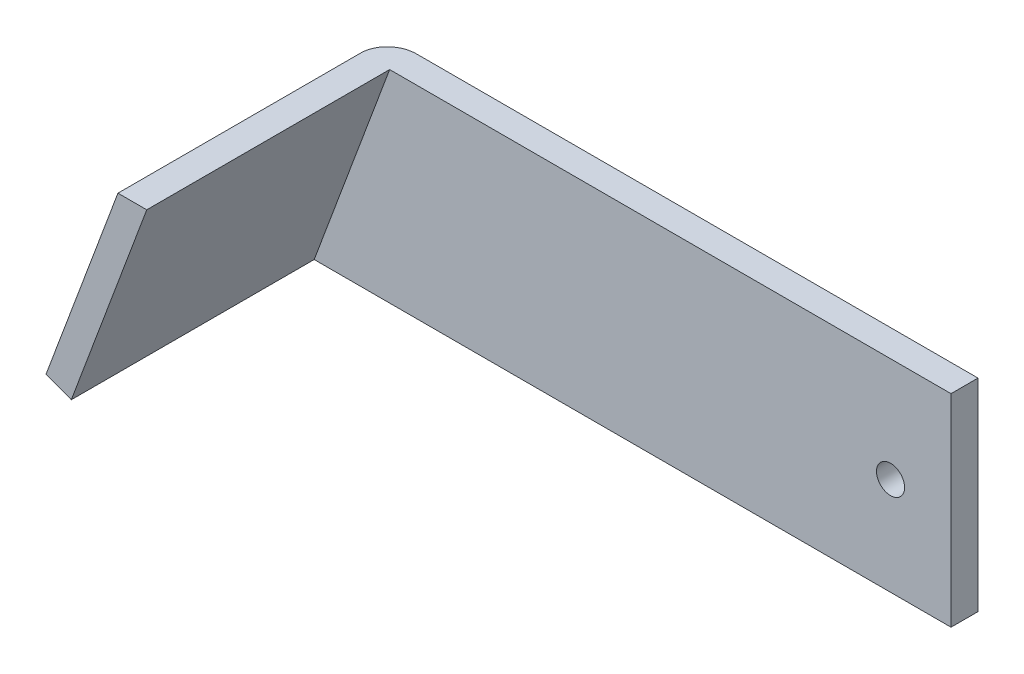
ISO-10303-21;
HEADER;
FILE_DESCRIPTION(('STEP AP214'),'2;1');
FILE_NAME('part.step','',(''),(''),'','','');
FILE_SCHEMA(('AUTOMOTIVE_DESIGN { 1 0 10303 214 1 1 1 1 }'));
ENDSEC;
DATA;
#1=APPLICATION_CONTEXT('core data for automotive mechanical design processes');
#2=APPLICATION_PROTOCOL_DEFINITION('international standard','automotive_design',2000,#1);
#3=PRODUCT_CONTEXT('',#1,'mechanical');
#4=PRODUCT('Part','Part','',(#3));
#5=PRODUCT_RELATED_PRODUCT_CATEGORY('part','',(#4));
#6=PRODUCT_DEFINITION_FORMATION('','',#4);
#7=PRODUCT_DEFINITION_CONTEXT('part definition',#1,'design');
#8=PRODUCT_DEFINITION('design','',#6,#7);
#9=PRODUCT_DEFINITION_SHAPE('','',#8);
#10=(LENGTH_UNIT() NAMED_UNIT(*) SI_UNIT(.MILLI.,.METRE.));
#11=(NAMED_UNIT(*) PLANE_ANGLE_UNIT() SI_UNIT($,.RADIAN.));
#12=(NAMED_UNIT(*) SI_UNIT($,.STERADIAN.) SOLID_ANGLE_UNIT());
#13=UNCERTAINTY_MEASURE_WITH_UNIT(LENGTH_MEASURE(1.E-05),#10,'distance_accuracy_value','');
#14=(GEOMETRIC_REPRESENTATION_CONTEXT(3) GLOBAL_UNCERTAINTY_ASSIGNED_CONTEXT((#13)) GLOBAL_UNIT_ASSIGNED_CONTEXT((#10,
#11,#12)) REPRESENTATION_CONTEXT('',''));
#15=CARTESIAN_POINT('',(0.,0.,0.));
#16=DIRECTION('',(0.,0.,1.));
#17=DIRECTION('',(1.,0.,0.));
#18=AXIS2_PLACEMENT_3D('',#15,#16,#17);
#19=CARTESIAN_POINT('',(-66.04,0.,-3.175));
#20=DIRECTION('',(0.,1.,0.));
#21=DIRECTION('',(0.,0.,1.));
#22=AXIS2_PLACEMENT_3D('',#19,#20,#21);
#23=PLANE('',#22);
#24=DIRECTION('',(-1.,0.,0.));
#25=VECTOR('',#24,1.);
#26=CARTESIAN_POINT('',(-66.04,0.,0.));
#27=LINE('',#26,#25);
#28=CARTESIAN_POINT('',(0.,0.,0.));
#29=VERTEX_POINT('',#28);
#30=CARTESIAN_POINT('',(-66.04,0.,0.));
#31=VERTEX_POINT('',#30);
#32=EDGE_CURVE('E118',#29,#31,#27,.T.);
#33=ORIENTED_EDGE('',*,*,#32,.F.);
#34=DIRECTION('',(0.,0.,1.));
#35=VECTOR('',#34,1.);
#36=CARTESIAN_POINT('',(0.,0.,-3.175));
#37=LINE('',#36,#35);
#38=CARTESIAN_POINT('',(0.,0.,-3.175));
#39=VERTEX_POINT('',#38);
#40=EDGE_CURVE('E11',#39,#29,#37,.T.);
#41=ORIENTED_EDGE('',*,*,#40,.F.);
#42=DIRECTION('',(-1.,0.,0.));
#43=VECTOR('',#42,1.);
#44=CARTESIAN_POINT('',(-66.04,0.,-3.175));
#45=LINE('',#44,#43);
#46=CARTESIAN_POINT('',(-66.04,0.,-3.17499999999999));
#47=VERTEX_POINT('',#46);
#48=EDGE_CURVE('E116',#39,#47,#45,.T.);
#49=ORIENTED_EDGE('',*,*,#48,.T.);
#50=CARTESIAN_POINT('',(-66.04,0.,0.));
#51=DIRECTION('',(0.,-1.,0.));
#52=DIRECTION('',(1.,0.,0.));
#53=AXIS2_PLACEMENT_3D('',#50,#51,#52);
#54=ELLIPSE('',#53,3.38877601493509,3.175);
#55=CARTESIAN_POINT('',(-69.4287760149352,0.,0.));
#56=VERTEX_POINT('',#55);
#57=EDGE_CURVE('E101',#47,#56,#54,.F.);
#58=ORIENTED_EDGE('',*,*,#57,.T.);
#59=DIRECTION('',(0.,0.,1.));
#60=VECTOR('',#59,1.);
#61=CARTESIAN_POINT('',(-69.4287760149352,0.,-5.588));
#62=LINE('',#61,#60);
#63=CARTESIAN_POINT('',(-69.4287760149352,0.,28.575));
#64=VERTEX_POINT('',#63);
#65=EDGE_CURVE('E303',#56,#64,#62,.T.);
#66=ORIENTED_EDGE('',*,*,#65,.T.);
#67=DIRECTION('',(-1.,0.,0.));
#68=VECTOR('',#67,1.);
#69=CARTESIAN_POINT('',(-69.0147097345982,0.,28.575));
#70=LINE('',#69,#68);
#71=CARTESIAN_POINT('',(-66.0400000000001,0.,28.575));
#72=VERTEX_POINT('',#71);
#73=EDGE_CURVE('E109',#72,#64,#70,.T.);
#74=ORIENTED_EDGE('',*,*,#73,.F.);
#75=DIRECTION('',(0.,0.,-1.));
#76=VECTOR('',#75,1.);
#77=CARTESIAN_POINT('',(-66.04,0.,0.));
#78=LINE('',#77,#76);
#79=EDGE_CURVE('E143',#72,#31,#78,.T.);
#80=ORIENTED_EDGE('',*,*,#79,.T.);
#81=EDGE_LOOP('',(#33,#41,#49,#58,#66,#74,#80));
#82=FACE_BOUND('',#81,.T.);
#83=ADVANCED_FACE('F36',(#82),#23,.T.);
#84=CARTESIAN_POINT('',(0.,-23.7976778767849,-3.175));
#85=DIRECTION('',(1.,0.,0.));
#86=DIRECTION('',(0.,0.,-1.));
#87=AXIS2_PLACEMENT_3D('',#84,#85,#86);
#88=PLANE('',#87);
#89=DIRECTION('',(0.,1.,0.));
#90=VECTOR('',#89,1.);
#91=CARTESIAN_POINT('',(0.,-23.7976778767849,0.));
#92=LINE('',#91,#90);
#93=CARTESIAN_POINT('',(0.,-23.7976778767849,0.));
#94=VERTEX_POINT('',#93);
#95=EDGE_CURVE('E131',#94,#29,#92,.T.);
#96=ORIENTED_EDGE('',*,*,#95,.F.);
#97=DIRECTION('',(0.,0.,1.));
#98=VECTOR('',#97,1.);
#99=CARTESIAN_POINT('',(0.,-23.7976778767849,-3.175));
#100=LINE('',#99,#98);
#101=CARTESIAN_POINT('',(0.,-23.7976778767849,-3.175));
#102=VERTEX_POINT('',#101);
#103=EDGE_CURVE('E46',#102,#94,#100,.T.);
#104=ORIENTED_EDGE('',*,*,#103,.F.);
#105=DIRECTION('',(0.,1.,0.));
#106=VECTOR('',#105,1.);
#107=CARTESIAN_POINT('',(0.,-23.7976778767849,-3.175));
#108=LINE('',#107,#106);
#109=EDGE_CURVE('E120',#102,#39,#108,.T.);
#110=ORIENTED_EDGE('',*,*,#109,.T.);
#111=ORIENTED_EDGE('',*,*,#40,.T.);
#112=EDGE_LOOP('',(#96,#104,#110,#111));
#113=FACE_BOUND('',#112,.T.);
#114=ADVANCED_FACE('F178',(#113),#88,.T.);
#115=CARTESIAN_POINT('',(-74.9186557356835,-23.7976778767849,-3.175));
#116=DIRECTION('',(0.,-1.,0.));
#117=DIRECTION('',(1.,0.,0.));
#118=AXIS2_PLACEMENT_3D('',#115,#116,#117);
#119=PLANE('',#118);
#120=DIRECTION('',(1.,0.,0.));
#121=VECTOR('',#120,1.);
#122=CARTESIAN_POINT('',(-74.9186557356835,-23.7976778767849,0.));
#123=LINE('',#122,#121);
#124=CARTESIAN_POINT('',(-74.9186557356835,-23.7976778767848,0.));
#125=VERTEX_POINT('',#124);
#126=EDGE_CURVE('E127',#125,#94,#123,.T.);
#127=ORIENTED_EDGE('',*,*,#126,.F.);
#128=DIRECTION('',(0.,0.,1.));
#129=VECTOR('',#128,1.);
#130=CARTESIAN_POINT('',(-74.9186557356835,-23.7976778767849,-3.175));
#131=LINE('',#130,#129);
#132=CARTESIAN_POINT('',(-74.9186557356835,-23.7976778767849,-3.175));
#133=VERTEX_POINT('',#132);
#134=EDGE_CURVE('E40',#133,#125,#131,.T.);
#135=ORIENTED_EDGE('',*,*,#134,.F.);
#136=DIRECTION('',(1.,0.,0.));
#137=VECTOR('',#136,1.);
#138=CARTESIAN_POINT('',(-74.9186557356835,-23.7976778767849,-3.175));
#139=LINE('',#138,#137);
#140=EDGE_CURVE('E117',#133,#102,#139,.T.);
#141=ORIENTED_EDGE('',*,*,#140,.T.);
#142=ORIENTED_EDGE('',*,*,#103,.T.);
#143=EDGE_LOOP('',(#127,#135,#141,#142));
#144=FACE_BOUND('',#143,.T.);
#145=ADVANCED_FACE('F38',(#144),#119,.T.);
#146=CARTESIAN_POINT('',(0.,0.,-3.175));
#147=DIRECTION('',(0.,0.,1.));
#148=DIRECTION('',(1.,0.,0.));
#149=AXIS2_PLACEMENT_3D('',#146,#147,#148);
#150=PLANE('',#149);
#151=CARTESIAN_POINT('',(-7.112,-12.2967276653846,-3.175));
#152=DIRECTION('',(0.,0.,1.));
#153=DIRECTION('',(1.,0.,0.));
#154=AXIS2_PLACEMENT_3D('',#151,#152,#153);
#155=CIRCLE('',#154,1.651);
#156=CARTESIAN_POINT('',(-5.461,-12.2967276653846,-3.175));
#157=VERTEX_POINT('',#156);
#158=EDGE_CURVE('E128',#157,#157,#155,.T.);
#159=ORIENTED_EDGE('',*,*,#158,.T.);
#160=EDGE_LOOP('',(#159));
#161=FACE_BOUND('',#160,.T.);
#162=DIRECTION('',(-0.349553375420609,-0.936916451841923,0.));
#163=VECTOR('',#162,1.);
#164=CARTESIAN_POINT('',(-66.04,0.,-3.175));
#165=LINE('',#164,#163);
#166=EDGE_CURVE('E104',#47,#133,#165,.T.);
#167=ORIENTED_EDGE('',*,*,#166,.F.);
#168=ORIENTED_EDGE('',*,*,#48,.F.);
#169=ORIENTED_EDGE('',*,*,#109,.F.);
#170=ORIENTED_EDGE('',*,*,#140,.F.);
#171=EDGE_LOOP('',(#167,#168,#169,#170));
#172=FACE_BOUND('',#171,.T.);
#173=ADVANCED_FACE('F114',(#161,#172),#150,.F.);
#174=CARTESIAN_POINT('',(0.,0.,0.));
#175=DIRECTION('',(0.,0.,1.));
#176=DIRECTION('',(1.,0.,0.));
#177=AXIS2_PLACEMENT_3D('',#174,#175,#176);
#178=PLANE('',#177);
#179=CARTESIAN_POINT('',(-7.112,-12.2967276653846,0.));
#180=DIRECTION('',(0.,0.,1.));
#181=DIRECTION('',(1.,0.,0.));
#182=AXIS2_PLACEMENT_3D('',#179,#180,#181);
#183=CIRCLE('',#182,1.651);
#184=CARTESIAN_POINT('',(-5.461,-12.2967276653846,0.));
#185=VERTEX_POINT('',#184);
#186=EDGE_CURVE('E157',#185,#185,#183,.T.);
#187=ORIENTED_EDGE('',*,*,#186,.F.);
#188=EDGE_LOOP('',(#187));
#189=FACE_BOUND('',#188,.T.);
#190=DIRECTION('',(-0.349553375420609,-0.936916451841923,0.));
#191=VECTOR('',#190,1.);
#192=CARTESIAN_POINT('',(-66.04,0.,0.));
#193=LINE('',#192,#191);
#194=EDGE_CURVE('E125',#31,#125,#193,.T.);
#195=ORIENTED_EDGE('',*,*,#194,.T.);
#196=ORIENTED_EDGE('',*,*,#126,.T.);
#197=ORIENTED_EDGE('',*,*,#95,.T.);
#198=ORIENTED_EDGE('',*,*,#32,.T.);
#199=EDGE_LOOP('',(#195,#196,#197,#198));
#200=FACE_BOUND('',#199,.T.);
#201=ADVANCED_FACE('F137',(#189,#200),#178,.T.);
#202=CARTESIAN_POINT('',(-7.112,-12.2967276653846,-3.175));
#203=DIRECTION('',(0.,0.,1.));
#204=DIRECTION('',(1.,0.,0.));
#205=AXIS2_PLACEMENT_3D('',#202,#203,#204);
#206=CYLINDRICAL_SURFACE('',#205,1.651);
#207=ORIENTED_EDGE('',*,*,#158,.F.);
#208=EDGE_LOOP('',(#207));
#209=FACE_BOUND('',#208,.T.);
#210=ORIENTED_EDGE('',*,*,#186,.T.);
#211=EDGE_LOOP('',(#210));
#212=FACE_BOUND('',#211,.T.);
#213=ADVANCED_FACE('F168',(#209,#212),#206,.F.);
#214=CARTESIAN_POINT('',(-74.9186557356835,-23.7976778767849,-3.175));
#215=DIRECTION('',(-0.349553375420609,-0.936916451841923,0.));
#216=DIRECTION('',(0.936916451841923,-0.349553375420609,0.));
#217=AXIS2_PLACEMENT_3D('',#214,#215,#216);
#218=PLANE('',#217);
#219=CARTESIAN_POINT('',(-74.9186557356835,-23.7976778767849,0.));
#220=DIRECTION('',(0.349553375420609,0.936916451841923,0.));
#221=DIRECTION('',(-0.936916451841923,0.349553375420609,0.));
#222=AXIS2_PLACEMENT_3D('',#219,#220,#221);
#223=CIRCLE('',#222,3.175);
#224=CARTESIAN_POINT('',(-77.8933654702816,-22.6878459098244,0.));
#225=VERTEX_POINT('',#224);
#226=EDGE_CURVE('E71',#133,#225,#223,.T.);
#227=ORIENTED_EDGE('',*,*,#226,.F.);
#228=ORIENTED_EDGE('',*,*,#134,.T.);
#229=DIRECTION('',(0.936916451841923,-0.349553375420609,0.));
#230=VECTOR('',#229,1.);
#231=CARTESIAN_POINT('',(-77.8933654702816,-22.6878459098244,0.));
#232=LINE('',#231,#230);
#233=EDGE_CURVE('E152',#225,#125,#232,.T.);
#234=ORIENTED_EDGE('',*,*,#233,.F.);
#235=EDGE_LOOP('',(#227,#228,#234));
#236=FACE_BOUND('',#235,.T.);
#237=ADVANCED_FACE('F166',(#236),#218,.T.);
#238=CARTESIAN_POINT('',(-66.04,0.,0.));
#239=DIRECTION('',(0.349553375420609,0.936916451841923,0.));
#240=DIRECTION('',(-0.936916451841923,0.349553375420609,0.));
#241=AXIS2_PLACEMENT_3D('',#238,#239,#240);
#242=CYLINDRICAL_SURFACE('',#241,3.175);
#243=ORIENTED_EDGE('',*,*,#57,.F.);
#244=ORIENTED_EDGE('',*,*,#166,.T.);
#245=ORIENTED_EDGE('',*,*,#226,.T.);
#246=DIRECTION('',(-0.349553375420609,-0.936916451841923,0.));
#247=VECTOR('',#246,1.);
#248=CARTESIAN_POINT('',(-69.0147097345981,1.10983196696044,0.));
#249=LINE('',#248,#247);
#250=EDGE_CURVE('E106',#56,#225,#249,.T.);
#251=ORIENTED_EDGE('',*,*,#250,.F.);
#252=EDGE_LOOP('',(#243,#244,#245,#251));
#253=FACE_BOUND('',#252,.T.);
#254=ADVANCED_FACE('F103',(#253),#242,.T.);
#255=CARTESIAN_POINT('',(-77.8933654702817,-22.6878459098244,28.575));
#256=DIRECTION('',(0.349553375420609,0.936916451841923,0.));
#257=DIRECTION('',(-0.936916451841923,0.349553375420609,0.));
#258=AXIS2_PLACEMENT_3D('',#255,#256,#257);
#259=PLANE('',#258);
#260=DIRECTION('',(0.,0.,1.));
#261=VECTOR('',#260,1.);
#262=CARTESIAN_POINT('',(-74.9186557356836,-23.7976778767848,28.575));
#263=LINE('',#262,#261);
#264=CARTESIAN_POINT('',(-74.9186557356836,-23.7976778767848,28.575));
#265=VERTEX_POINT('',#264);
#266=EDGE_CURVE('E108',#125,#265,#263,.T.);
#267=ORIENTED_EDGE('',*,*,#266,.T.);
#268=DIRECTION('',(0.936916451841923,-0.349553375420609,0.));
#269=VECTOR('',#268,1.);
#270=CARTESIAN_POINT('',(-77.8933654702817,-22.6878459098244,28.575));
#271=LINE('',#270,#269);
#272=CARTESIAN_POINT('',(-77.8933654702817,-22.6878459098244,28.575));
#273=VERTEX_POINT('',#272);
#274=EDGE_CURVE('E155',#273,#265,#271,.T.);
#275=ORIENTED_EDGE('',*,*,#274,.F.);
#276=DIRECTION('',(0.,0.,1.));
#277=VECTOR('',#276,1.);
#278=CARTESIAN_POINT('',(-77.8933654702817,-22.6878459098244,28.575));
#279=LINE('',#278,#277);
#280=EDGE_CURVE('E154',#225,#273,#279,.T.);
#281=ORIENTED_EDGE('',*,*,#280,.F.);
#282=ORIENTED_EDGE('',*,*,#233,.T.);
#283=EDGE_LOOP('',(#267,#275,#281,#282));
#284=FACE_BOUND('',#283,.T.);
#285=ADVANCED_FACE('F153',(#284),#259,.F.);
#286=CARTESIAN_POINT('',(-69.0147097345982,1.10983196696048,28.575));
#287=DIRECTION('',(0.,0.,-1.));
#288=DIRECTION('',(-1.,0.,0.));
#289=AXIS2_PLACEMENT_3D('',#286,#287,#288);
#290=PLANE('',#289);
#291=DIRECTION('',(0.349553375420609,0.936916451841923,0.));
#292=VECTOR('',#291,1.);
#293=CARTESIAN_POINT('',(-66.0400000000001,0.,28.575));
#294=LINE('',#293,#292);
#295=EDGE_CURVE('E146',#265,#72,#294,.T.);
#296=ORIENTED_EDGE('',*,*,#295,.T.);
#297=ORIENTED_EDGE('',*,*,#73,.T.);
#298=DIRECTION('',(0.349553375420609,0.936916451841923,0.));
#299=VECTOR('',#298,1.);
#300=CARTESIAN_POINT('',(-69.0147097345982,1.10983196696048,28.575));
#301=LINE('',#300,#299);
#302=EDGE_CURVE('E159',#273,#64,#301,.T.);
#303=ORIENTED_EDGE('',*,*,#302,.F.);
#304=ORIENTED_EDGE('',*,*,#274,.T.);
#305=EDGE_LOOP('',(#296,#297,#303,#304));
#306=FACE_BOUND('',#305,.T.);
#307=ADVANCED_FACE('F235',(#306),#290,.F.);
#308=CARTESIAN_POINT('',(-60.9454431224233,22.7380844023669,-2.11522552672524E-13));
#309=DIRECTION('',(0.936916451841923,-0.349553375420609,0.));
#310=DIRECTION('',(0.349553375420609,0.936916451841923,0.));
#311=AXIS2_PLACEMENT_3D('',#308,#309,#310);
#312=PLANE('',#311);
#313=ORIENTED_EDGE('',*,*,#302,.T.);
#314=ORIENTED_EDGE('',*,*,#65,.F.);
#315=ORIENTED_EDGE('',*,*,#250,.T.);
#316=ORIENTED_EDGE('',*,*,#280,.T.);
#317=EDGE_LOOP('',(#313,#314,#315,#316));
#318=FACE_BOUND('',#317,.T.);
#319=ADVANCED_FACE('F240',(#318),#312,.F.);
#320=CARTESIAN_POINT('',(-57.9707333878252,21.6282524354065,-2.00437099421697E-13));
#321=DIRECTION('',(0.936916451841923,-0.349553375420609,0.));
#322=DIRECTION('',(0.349553375420609,0.936916451841923,0.));
#323=AXIS2_PLACEMENT_3D('',#320,#321,#322);
#324=PLANE('',#323);
#325=ORIENTED_EDGE('',*,*,#194,.F.);
#326=ORIENTED_EDGE('',*,*,#79,.F.);
#327=ORIENTED_EDGE('',*,*,#295,.F.);
#328=ORIENTED_EDGE('',*,*,#266,.F.);
#329=EDGE_LOOP('',(#325,#326,#327,#328));
#330=FACE_BOUND('',#329,.T.);
#331=ADVANCED_FACE('F141',(#330),#324,.T.);
#332=CLOSED_SHELL('',(#83,#114,#145,#173,#201,#213,#237,#254,#285,#307,#319,#331));
#333=MANIFOLD_SOLID_BREP('B2',#332);
#334=ADVANCED_BREP_SHAPE_REPRESENTATION('',(#18,#333),#14);
#335=SHAPE_DEFINITION_REPRESENTATION(#9,#334);
ENDSEC;
END-ISO-10303-21;
